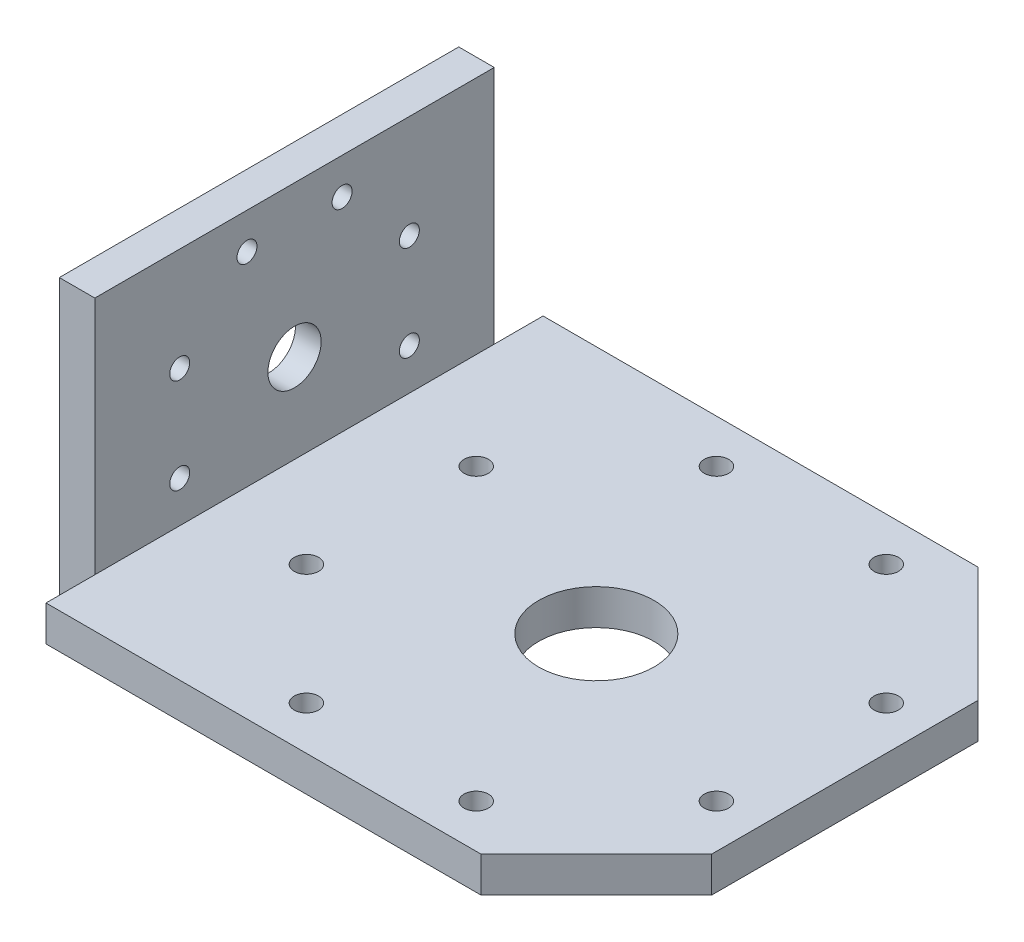
ISO-10303-21;
HEADER;
FILE_DESCRIPTION(('STEP AP214'),'2;1');
FILE_NAME('part.step','',(''),(''),'','','');
FILE_SCHEMA(('AUTOMOTIVE_DESIGN { 1 0 10303 214 1 1 1 1 }'));
ENDSEC;
DATA;
#1=APPLICATION_CONTEXT('core data for automotive mechanical design processes');
#2=APPLICATION_PROTOCOL_DEFINITION('international standard','automotive_design',2000,#1);
#3=PRODUCT_CONTEXT('',#1,'mechanical');
#4=PRODUCT('Part','Part','',(#3));
#5=PRODUCT_RELATED_PRODUCT_CATEGORY('part','',(#4));
#6=PRODUCT_DEFINITION_FORMATION('','',#4);
#7=PRODUCT_DEFINITION_CONTEXT('part definition',#1,'design');
#8=PRODUCT_DEFINITION('design','',#6,#7);
#9=PRODUCT_DEFINITION_SHAPE('','',#8);
#10=(LENGTH_UNIT() NAMED_UNIT(*) SI_UNIT(.MILLI.,.METRE.));
#11=(NAMED_UNIT(*) PLANE_ANGLE_UNIT() SI_UNIT($,.RADIAN.));
#12=(NAMED_UNIT(*) SI_UNIT($,.STERADIAN.) SOLID_ANGLE_UNIT());
#13=UNCERTAINTY_MEASURE_WITH_UNIT(LENGTH_MEASURE(1.E-05),#10,'distance_accuracy_value','');
#14=(GEOMETRIC_REPRESENTATION_CONTEXT(3) GLOBAL_UNCERTAINTY_ASSIGNED_CONTEXT((#13)) GLOBAL_UNIT_ASSIGNED_CONTEXT((#10,
#11,#12)) REPRESENTATION_CONTEXT('',''));
#15=CARTESIAN_POINT('',(0.,0.,0.));
#16=DIRECTION('',(0.,0.,1.));
#17=DIRECTION('',(1.,0.,0.));
#18=AXIS2_PLACEMENT_3D('',#15,#16,#17);
#19=CARTESIAN_POINT('',(-68.,0.,0.));
#20=DIRECTION('',(1.,0.,0.));
#21=DIRECTION('',(0.,0.,-1.));
#22=AXIS2_PLACEMENT_3D('',#19,#20,#21);
#23=PLANE('',#22);
#24=DIRECTION('',(0.,1.,0.));
#25=VECTOR('',#24,1.);
#26=CARTESIAN_POINT('',(-68.,-36.,-45.));
#27=LINE('',#26,#25);
#28=CARTESIAN_POINT('',(-68.,-36.,-45.));
#29=VERTEX_POINT('',#28);
#30=CARTESIAN_POINT('',(-68.,-28.,-45.));
#31=VERTEX_POINT('',#30);
#32=EDGE_CURVE('E240',#29,#31,#27,.T.);
#33=ORIENTED_EDGE('',*,*,#32,.T.);
#34=DIRECTION('',(0.,0.,1.));
#35=VECTOR('',#34,1.);
#36=CARTESIAN_POINT('',(-68.,-28.,56.));
#37=LINE('',#36,#35);
#38=CARTESIAN_POINT('',(-68.,-28.,-11.4360721315195));
#39=VERTEX_POINT('',#38);
#40=EDGE_CURVE('E11',#31,#39,#37,.T.);
#41=ORIENTED_EDGE('',*,*,#40,.T.);
#42=CARTESIAN_POINT('',(-68.,-25.868626910316,-10.7151361062225));
#43=DIRECTION('',(1.,0.,0.));
#44=DIRECTION('',(0.,0.,-1.));
#45=AXIS2_PLACEMENT_3D('',#42,#43,#44);
#46=CIRCLE('',#45,2.25);
#47=CARTESIAN_POINT('',(-68.,-28.,-9.99420008092556));
#48=VERTEX_POINT('',#47);
#49=EDGE_CURVE('E187',#48,#39,#46,.T.);
#50=ORIENTED_EDGE('',*,*,#49,.F.);
#51=CARTESIAN_POINT('',(-68.,-28.,9.99420008092553));
#52=VERTEX_POINT('',#51);
#53=EDGE_CURVE('E48',#48,#52,#37,.T.);
#54=ORIENTED_EDGE('',*,*,#53,.T.);
#55=CARTESIAN_POINT('',(-68.,-25.868626910316,10.7151361062225));
#56=DIRECTION('',(1.,0.,0.));
#57=DIRECTION('',(0.,0.,-1.));
#58=AXIS2_PLACEMENT_3D('',#55,#56,#57);
#59=CIRCLE('',#58,2.25);
#60=CARTESIAN_POINT('',(-68.,-28.,11.4360721315195));
#61=VERTEX_POINT('',#60);
#62=EDGE_CURVE('E193',#61,#52,#59,.T.);
#63=ORIENTED_EDGE('',*,*,#62,.F.);
#64=CARTESIAN_POINT('',(-68.,-28.,45.));
#65=VERTEX_POINT('',#64);
#66=EDGE_CURVE('E264',#61,#65,#37,.T.);
#67=ORIENTED_EDGE('',*,*,#66,.T.);
#68=DIRECTION('',(0.,-1.,0.));
#69=VECTOR('',#68,1.);
#70=CARTESIAN_POINT('',(-68.,34.,45.));
#71=LINE('',#70,#69);
#72=CARTESIAN_POINT('',(-68.,-36.,45.));
#73=VERTEX_POINT('',#72);
#74=EDGE_CURVE('E241',#65,#73,#71,.T.);
#75=ORIENTED_EDGE('',*,*,#74,.T.);
#76=DIRECTION('',(0.,0.,-1.));
#77=VECTOR('',#76,1.);
#78=CARTESIAN_POINT('',(-68.,-36.,45.));
#79=LINE('',#78,#77);
#80=EDGE_CURVE('E235',#73,#29,#79,.T.);
#81=ORIENTED_EDGE('',*,*,#80,.T.);
#82=EDGE_LOOP('',(#33,#41,#50,#54,#63,#67,#75,#81));
#83=FACE_BOUND('',#82,.T.);
#84=ADVANCED_FACE('F39',(#83),#23,.T.);
#85=DIRECTION('',(0.,0.,1.));
#86=VECTOR('',#85,1.);
#87=CARTESIAN_POINT('',(-68.,-20.,56.));
#88=LINE('',#87,#86);
#89=CARTESIAN_POINT('',(-68.,-20.,-45.));
#90=VERTEX_POINT('',#89);
#91=CARTESIAN_POINT('',(-68.,-20.,45.));
#92=VERTEX_POINT('',#91);
#93=EDGE_CURVE('E149',#90,#92,#88,.T.);
#94=ORIENTED_EDGE('',*,*,#93,.F.);
#95=CARTESIAN_POINT('',(-68.,34.,-45.));
#96=VERTEX_POINT('',#95);
#97=EDGE_CURVE('E233',#90,#96,#27,.T.);
#98=ORIENTED_EDGE('',*,*,#97,.T.);
#99=DIRECTION('',(0.,0.,1.));
#100=VECTOR('',#99,1.);
#101=CARTESIAN_POINT('',(-68.,34.,-45.));
#102=LINE('',#101,#100);
#103=CARTESIAN_POINT('',(-68.,34.,45.));
#104=VERTEX_POINT('',#103);
#105=EDGE_CURVE('E239',#96,#104,#102,.T.);
#106=ORIENTED_EDGE('',*,*,#105,.T.);
#107=EDGE_CURVE('E245',#104,#92,#71,.T.);
#108=ORIENTED_EDGE('',*,*,#107,.T.);
#109=EDGE_LOOP('',(#94,#98,#106,#108));
#110=FACE_BOUND('',#109,.T.);
#111=CARTESIAN_POINT('',(-68.,-10.7151361062225,-25.868626910316));
#112=DIRECTION('',(1.,0.,0.));
#113=DIRECTION('',(0.,0.,-1.));
#114=AXIS2_PLACEMENT_3D('',#111,#112,#113);
#115=CIRCLE('',#114,2.25);
#116=CARTESIAN_POINT('',(-68.,-10.7151361062225,-28.118626910316));
#117=VERTEX_POINT('',#116);
#118=EDGE_CURVE('E184',#117,#117,#115,.T.);
#119=ORIENTED_EDGE('',*,*,#118,.F.);
#120=EDGE_LOOP('',(#119));
#121=FACE_BOUND('',#120,.T.);
#122=CARTESIAN_POINT('',(-68.,10.7151361062225,25.868626910316));
#123=DIRECTION('',(1.,0.,0.));
#124=DIRECTION('',(0.,0.,-1.));
#125=AXIS2_PLACEMENT_3D('',#122,#123,#124);
#126=CIRCLE('',#125,2.25);
#127=CARTESIAN_POINT('',(-68.,10.7151361062225,23.618626910316));
#128=VERTEX_POINT('',#127);
#129=EDGE_CURVE('E208',#128,#128,#126,.T.);
#130=ORIENTED_EDGE('',*,*,#129,.F.);
#131=EDGE_LOOP('',(#130));
#132=FACE_BOUND('',#131,.T.);
#133=CARTESIAN_POINT('',(-68.,25.868626910316,-10.7151361062225));
#134=DIRECTION('',(1.,0.,0.));
#135=DIRECTION('',(0.,0.,-1.));
#136=AXIS2_PLACEMENT_3D('',#133,#134,#135);
#137=CIRCLE('',#136,2.25);
#138=CARTESIAN_POINT('',(-68.,25.868626910316,-12.9651361062225));
#139=VERTEX_POINT('',#138);
#140=EDGE_CURVE('E219',#139,#139,#137,.T.);
#141=ORIENTED_EDGE('',*,*,#140,.F.);
#142=EDGE_LOOP('',(#141));
#143=FACE_BOUND('',#142,.T.);
#144=CARTESIAN_POINT('',(-68.,10.7151361062225,-25.868626910316));
#145=DIRECTION('',(1.,0.,0.));
#146=DIRECTION('',(0.,0.,-1.));
#147=AXIS2_PLACEMENT_3D('',#144,#145,#146);
#148=CIRCLE('',#147,2.25);
#149=CARTESIAN_POINT('',(-68.,10.7151361062225,-28.118626910316));
#150=VERTEX_POINT('',#149);
#151=EDGE_CURVE('E229',#150,#150,#148,.T.);
#152=ORIENTED_EDGE('',*,*,#151,.F.);
#153=EDGE_LOOP('',(#152));
#154=FACE_BOUND('',#153,.T.);
#155=CARTESIAN_POINT('',(-68.,25.868626910316,10.7151361062225));
#156=DIRECTION('',(1.,0.,0.));
#157=DIRECTION('',(0.,0.,-1.));
#158=AXIS2_PLACEMENT_3D('',#155,#156,#157);
#159=CIRCLE('',#158,2.25);
#160=CARTESIAN_POINT('',(-68.,25.868626910316,8.46513610622251));
#161=VERTEX_POINT('',#160);
#162=EDGE_CURVE('E212',#161,#161,#159,.T.);
#163=ORIENTED_EDGE('',*,*,#162,.F.);
#164=EDGE_LOOP('',(#163));
#165=FACE_BOUND('',#164,.T.);
#166=CARTESIAN_POINT('',(-68.,-10.7151361062225,25.868626910316));
#167=DIRECTION('',(1.,0.,0.));
#168=DIRECTION('',(0.,0.,-1.));
#169=AXIS2_PLACEMENT_3D('',#166,#167,#168);
#170=CIRCLE('',#169,2.25);
#171=CARTESIAN_POINT('',(-68.,-10.7151361062225,23.618626910316));
#172=VERTEX_POINT('',#171);
#173=EDGE_CURVE('E205',#172,#172,#170,.T.);
#174=ORIENTED_EDGE('',*,*,#173,.F.);
#175=EDGE_LOOP('',(#174));
#176=FACE_BOUND('',#175,.T.);
#177=CARTESIAN_POINT('',(-68.,0.,0.));
#178=DIRECTION('',(1.,0.,0.));
#179=DIRECTION('',(0.,0.,-1.));
#180=AXIS2_PLACEMENT_3D('',#177,#178,#179);
#181=CIRCLE('',#180,6.);
#182=CARTESIAN_POINT('',(-68.,0.,-6.));
#183=VERTEX_POINT('',#182);
#184=EDGE_CURVE('E178',#183,#183,#181,.T.);
#185=ORIENTED_EDGE('',*,*,#184,.F.);
#186=EDGE_LOOP('',(#185));
#187=FACE_BOUND('',#186,.T.);
#188=ADVANCED_FACE('F281',(#110,#121,#132,#143,#154,#165,#176,#187),#23,.T.);
#189=CARTESIAN_POINT('',(-76.,0.,0.));
#190=DIRECTION('',(1.,0.,0.));
#191=DIRECTION('',(0.,0.,-1.));
#192=AXIS2_PLACEMENT_3D('',#189,#190,#191);
#193=PLANE('',#192);
#194=CARTESIAN_POINT('',(-76.,0.,0.));
#195=DIRECTION('',(1.,0.,0.));
#196=DIRECTION('',(0.,0.,-1.));
#197=AXIS2_PLACEMENT_3D('',#194,#195,#196);
#198=CIRCLE('',#197,22.15);
#199=CARTESIAN_POINT('',(-76.,0.,-22.15));
#200=VERTEX_POINT('',#199);
#201=EDGE_CURVE('E166',#200,#200,#198,.T.);
#202=ORIENTED_EDGE('',*,*,#201,.T.);
#203=EDGE_LOOP('',(#202));
#204=FACE_BOUND('',#203,.T.);
#205=DIRECTION('',(0.,0.,-1.));
#206=VECTOR('',#205,1.);
#207=CARTESIAN_POINT('',(-76.,-36.,45.));
#208=LINE('',#207,#206);
#209=CARTESIAN_POINT('',(-76.,-36.,45.));
#210=VERTEX_POINT('',#209);
#211=CARTESIAN_POINT('',(-76.,-36.,-45.));
#212=VERTEX_POINT('',#211);
#213=EDGE_CURVE('E228',#210,#212,#208,.T.);
#214=ORIENTED_EDGE('',*,*,#213,.F.);
#215=DIRECTION('',(0.,-1.,0.));
#216=VECTOR('',#215,1.);
#217=CARTESIAN_POINT('',(-76.,34.,45.));
#218=LINE('',#217,#216);
#219=CARTESIAN_POINT('',(-76.,34.,45.));
#220=VERTEX_POINT('',#219);
#221=EDGE_CURVE('E237',#220,#210,#218,.T.);
#222=ORIENTED_EDGE('',*,*,#221,.F.);
#223=DIRECTION('',(0.,0.,1.));
#224=VECTOR('',#223,1.);
#225=CARTESIAN_POINT('',(-76.,34.,-45.));
#226=LINE('',#225,#224);
#227=CARTESIAN_POINT('',(-76.,34.,-45.));
#228=VERTEX_POINT('',#227);
#229=EDGE_CURVE('E253',#228,#220,#226,.T.);
#230=ORIENTED_EDGE('',*,*,#229,.F.);
#231=DIRECTION('',(0.,1.,0.));
#232=VECTOR('',#231,1.);
#233=CARTESIAN_POINT('',(-76.,-36.,-45.));
#234=LINE('',#233,#232);
#235=EDGE_CURVE('E246',#212,#228,#234,.T.);
#236=ORIENTED_EDGE('',*,*,#235,.F.);
#237=EDGE_LOOP('',(#214,#222,#230,#236));
#238=FACE_BOUND('',#237,.T.);
#239=CARTESIAN_POINT('',(-76.,10.7151361062225,-25.868626910316));
#240=DIRECTION('',(1.,0.,0.));
#241=DIRECTION('',(0.,0.,-1.));
#242=AXIS2_PLACEMENT_3D('',#239,#240,#241);
#243=CIRCLE('',#242,2.25);
#244=CARTESIAN_POINT('',(-76.,10.7151361062225,-28.118626910316));
#245=VERTEX_POINT('',#244);
#246=EDGE_CURVE('E224',#245,#245,#243,.T.);
#247=ORIENTED_EDGE('',*,*,#246,.T.);
#248=EDGE_LOOP('',(#247));
#249=FACE_BOUND('',#248,.T.);
#250=CARTESIAN_POINT('',(-76.,25.868626910316,-10.7151361062225));
#251=DIRECTION('',(1.,0.,0.));
#252=DIRECTION('',(0.,0.,-1.));
#253=AXIS2_PLACEMENT_3D('',#250,#251,#252);
#254=CIRCLE('',#253,2.25);
#255=CARTESIAN_POINT('',(-76.,25.868626910316,-12.9651361062225));
#256=VERTEX_POINT('',#255);
#257=EDGE_CURVE('E220',#256,#256,#254,.T.);
#258=ORIENTED_EDGE('',*,*,#257,.T.);
#259=EDGE_LOOP('',(#258));
#260=FACE_BOUND('',#259,.T.);
#261=CARTESIAN_POINT('',(-76.,25.868626910316,10.7151361062225));
#262=DIRECTION('',(1.,0.,0.));
#263=DIRECTION('',(0.,0.,-1.));
#264=AXIS2_PLACEMENT_3D('',#261,#262,#263);
#265=CIRCLE('',#264,2.25);
#266=CARTESIAN_POINT('',(-76.,25.868626910316,8.46513610622251));
#267=VERTEX_POINT('',#266);
#268=EDGE_CURVE('E211',#267,#267,#265,.T.);
#269=ORIENTED_EDGE('',*,*,#268,.T.);
#270=EDGE_LOOP('',(#269));
#271=FACE_BOUND('',#270,.T.);
#272=CARTESIAN_POINT('',(-76.,10.7151361062225,25.868626910316));
#273=DIRECTION('',(1.,0.,0.));
#274=DIRECTION('',(0.,0.,-1.));
#275=AXIS2_PLACEMENT_3D('',#272,#273,#274);
#276=CIRCLE('',#275,2.25);
#277=CARTESIAN_POINT('',(-76.,10.7151361062225,23.618626910316));
#278=VERTEX_POINT('',#277);
#279=EDGE_CURVE('E202',#278,#278,#276,.T.);
#280=ORIENTED_EDGE('',*,*,#279,.T.);
#281=EDGE_LOOP('',(#280));
#282=FACE_BOUND('',#281,.T.);
#283=CARTESIAN_POINT('',(-76.,-10.7151361062225,25.868626910316));
#284=DIRECTION('',(1.,0.,0.));
#285=DIRECTION('',(0.,0.,-1.));
#286=AXIS2_PLACEMENT_3D('',#283,#284,#285);
#287=CIRCLE('',#286,2.25);
#288=CARTESIAN_POINT('',(-76.,-10.7151361062225,23.618626910316));
#289=VERTEX_POINT('',#288);
#290=EDGE_CURVE('E196',#289,#289,#287,.T.);
#291=ORIENTED_EDGE('',*,*,#290,.T.);
#292=EDGE_LOOP('',(#291));
#293=FACE_BOUND('',#292,.T.);
#294=CARTESIAN_POINT('',(-76.,-25.868626910316,10.7151361062225));
#295=DIRECTION('',(1.,0.,0.));
#296=DIRECTION('',(0.,0.,-1.));
#297=AXIS2_PLACEMENT_3D('',#294,#295,#296);
#298=CIRCLE('',#297,2.25);
#299=CARTESIAN_POINT('',(-76.,-25.868626910316,8.46513610622251));
#300=VERTEX_POINT('',#299);
#301=EDGE_CURVE('E195',#300,#300,#298,.T.);
#302=ORIENTED_EDGE('',*,*,#301,.T.);
#303=EDGE_LOOP('',(#302));
#304=FACE_BOUND('',#303,.T.);
#305=CARTESIAN_POINT('',(-76.,-25.868626910316,-10.7151361062225));
#306=DIRECTION('',(1.,0.,0.));
#307=DIRECTION('',(0.,0.,-1.));
#308=AXIS2_PLACEMENT_3D('',#305,#306,#307);
#309=CIRCLE('',#308,2.25);
#310=CARTESIAN_POINT('',(-76.,-25.868626910316,-12.9651361062225));
#311=VERTEX_POINT('',#310);
#312=EDGE_CURVE('E186',#311,#311,#309,.T.);
#313=ORIENTED_EDGE('',*,*,#312,.T.);
#314=EDGE_LOOP('',(#313));
#315=FACE_BOUND('',#314,.T.);
#316=CARTESIAN_POINT('',(-76.,-10.7151361062225,-25.868626910316));
#317=DIRECTION('',(1.,0.,0.));
#318=DIRECTION('',(0.,0.,-1.));
#319=AXIS2_PLACEMENT_3D('',#316,#317,#318);
#320=CIRCLE('',#319,2.25);
#321=CARTESIAN_POINT('',(-76.,-10.7151361062225,-28.118626910316));
#322=VERTEX_POINT('',#321);
#323=EDGE_CURVE('E181',#322,#322,#320,.T.);
#324=ORIENTED_EDGE('',*,*,#323,.T.);
#325=EDGE_LOOP('',(#324));
#326=FACE_BOUND('',#325,.T.);
#327=ADVANCED_FACE('F304',(#204,#238,#249,#260,#271,#282,#293,#304,#315,#326),#193,.F.);
#328=CARTESIAN_POINT('',(-68.,-36.,45.));
#329=DIRECTION('',(0.,1.,0.));
#330=DIRECTION('',(0.,0.,1.));
#331=AXIS2_PLACEMENT_3D('',#328,#329,#330);
#332=PLANE('',#331);
#333=ORIENTED_EDGE('',*,*,#213,.T.);
#334=DIRECTION('',(-1.,0.,0.));
#335=VECTOR('',#334,1.);
#336=CARTESIAN_POINT('',(-68.,-36.,-45.));
#337=LINE('',#336,#335);
#338=EDGE_CURVE('E261',#29,#212,#337,.T.);
#339=ORIENTED_EDGE('',*,*,#338,.F.);
#340=ORIENTED_EDGE('',*,*,#80,.F.);
#341=DIRECTION('',(-1.,0.,0.));
#342=VECTOR('',#341,1.);
#343=CARTESIAN_POINT('',(-68.,-36.,45.));
#344=LINE('',#343,#342);
#345=EDGE_CURVE('E242',#73,#210,#344,.T.);
#346=ORIENTED_EDGE('',*,*,#345,.T.);
#347=EDGE_LOOP('',(#333,#339,#340,#346));
#348=FACE_BOUND('',#347,.T.);
#349=ADVANCED_FACE('F41',(#348),#332,.F.);
#350=CARTESIAN_POINT('',(-68.,-36.,-45.));
#351=DIRECTION('',(0.,0.,1.));
#352=DIRECTION('',(1.,0.,0.));
#353=AXIS2_PLACEMENT_3D('',#350,#351,#352);
#354=PLANE('',#353);
#355=ORIENTED_EDGE('',*,*,#235,.T.);
#356=DIRECTION('',(-1.,0.,0.));
#357=VECTOR('',#356,1.);
#358=CARTESIAN_POINT('',(-68.,34.,-45.));
#359=LINE('',#358,#357);
#360=EDGE_CURVE('E259',#96,#228,#359,.T.);
#361=ORIENTED_EDGE('',*,*,#360,.F.);
#362=ORIENTED_EDGE('',*,*,#97,.F.);
#363=EDGE_CURVE('E238',#31,#90,#27,.T.);
#364=ORIENTED_EDGE('',*,*,#363,.F.);
#365=ORIENTED_EDGE('',*,*,#32,.F.);
#366=ORIENTED_EDGE('',*,*,#338,.T.);
#367=EDGE_LOOP('',(#355,#361,#362,#364,#365,#366));
#368=FACE_BOUND('',#367,.T.);
#369=ADVANCED_FACE('F287',(#368),#354,.F.);
#370=CARTESIAN_POINT('',(-68.,34.,-45.));
#371=DIRECTION('',(0.,-1.,0.));
#372=DIRECTION('',(0.,0.,-1.));
#373=AXIS2_PLACEMENT_3D('',#370,#371,#372);
#374=PLANE('',#373);
#375=ORIENTED_EDGE('',*,*,#229,.T.);
#376=DIRECTION('',(-1.,0.,0.));
#377=VECTOR('',#376,1.);
#378=CARTESIAN_POINT('',(-68.,34.,45.));
#379=LINE('',#378,#377);
#380=EDGE_CURVE('E258',#104,#220,#379,.T.);
#381=ORIENTED_EDGE('',*,*,#380,.F.);
#382=ORIENTED_EDGE('',*,*,#105,.F.);
#383=ORIENTED_EDGE('',*,*,#360,.T.);
#384=EDGE_LOOP('',(#375,#381,#382,#383));
#385=FACE_BOUND('',#384,.T.);
#386=ADVANCED_FACE('F286',(#385),#374,.F.);
#387=CARTESIAN_POINT('',(-68.,34.,45.));
#388=DIRECTION('',(0.,0.,-1.));
#389=DIRECTION('',(-1.,0.,0.));
#390=AXIS2_PLACEMENT_3D('',#387,#388,#389);
#391=PLANE('',#390);
#392=ORIENTED_EDGE('',*,*,#221,.T.);
#393=ORIENTED_EDGE('',*,*,#345,.F.);
#394=ORIENTED_EDGE('',*,*,#74,.F.);
#395=EDGE_CURVE('E247',#92,#65,#71,.T.);
#396=ORIENTED_EDGE('',*,*,#395,.F.);
#397=ORIENTED_EDGE('',*,*,#107,.F.);
#398=ORIENTED_EDGE('',*,*,#380,.T.);
#399=EDGE_LOOP('',(#392,#393,#394,#396,#397,#398));
#400=FACE_BOUND('',#399,.T.);
#401=ADVANCED_FACE('F294',(#400),#391,.F.);
#402=CARTESIAN_POINT('',(-68.,10.7151361062225,-25.868626910316));
#403=DIRECTION('',(-1.,0.,0.));
#404=DIRECTION('',(0.,0.,1.));
#405=AXIS2_PLACEMENT_3D('',#402,#403,#404);
#406=CYLINDRICAL_SURFACE('',#405,2.25);
#407=ORIENTED_EDGE('',*,*,#151,.T.);
#408=EDGE_LOOP('',(#407));
#409=FACE_BOUND('',#408,.T.);
#410=ORIENTED_EDGE('',*,*,#246,.F.);
#411=EDGE_LOOP('',(#410));
#412=FACE_BOUND('',#411,.T.);
#413=ADVANCED_FACE('F350',(#409,#412),#406,.F.);
#414=CARTESIAN_POINT('',(-68.,25.868626910316,-10.7151361062225));
#415=DIRECTION('',(-1.,0.,0.));
#416=DIRECTION('',(0.,0.,1.));
#417=AXIS2_PLACEMENT_3D('',#414,#415,#416);
#418=CYLINDRICAL_SURFACE('',#417,2.25);
#419=ORIENTED_EDGE('',*,*,#140,.T.);
#420=EDGE_LOOP('',(#419));
#421=FACE_BOUND('',#420,.T.);
#422=ORIENTED_EDGE('',*,*,#257,.F.);
#423=EDGE_LOOP('',(#422));
#424=FACE_BOUND('',#423,.T.);
#425=ADVANCED_FACE('F373',(#421,#424),#418,.F.);
#426=CARTESIAN_POINT('',(-68.,25.868626910316,10.7151361062225));
#427=DIRECTION('',(-1.,0.,0.));
#428=DIRECTION('',(0.,0.,1.));
#429=AXIS2_PLACEMENT_3D('',#426,#427,#428);
#430=CYLINDRICAL_SURFACE('',#429,2.25);
#431=ORIENTED_EDGE('',*,*,#162,.T.);
#432=EDGE_LOOP('',(#431));
#433=FACE_BOUND('',#432,.T.);
#434=ORIENTED_EDGE('',*,*,#268,.F.);
#435=EDGE_LOOP('',(#434));
#436=FACE_BOUND('',#435,.T.);
#437=ADVANCED_FACE('F381',(#433,#436),#430,.F.);
#438=CARTESIAN_POINT('',(-68.,10.7151361062225,25.868626910316));
#439=DIRECTION('',(-1.,0.,0.));
#440=DIRECTION('',(0.,0.,1.));
#441=AXIS2_PLACEMENT_3D('',#438,#439,#440);
#442=CYLINDRICAL_SURFACE('',#441,2.25);
#443=ORIENTED_EDGE('',*,*,#129,.T.);
#444=EDGE_LOOP('',(#443));
#445=FACE_BOUND('',#444,.T.);
#446=ORIENTED_EDGE('',*,*,#279,.F.);
#447=EDGE_LOOP('',(#446));
#448=FACE_BOUND('',#447,.T.);
#449=ADVANCED_FACE('F386',(#445,#448),#442,.F.);
#450=CARTESIAN_POINT('',(-68.,-10.7151361062225,25.868626910316));
#451=DIRECTION('',(-1.,0.,0.));
#452=DIRECTION('',(0.,0.,1.));
#453=AXIS2_PLACEMENT_3D('',#450,#451,#452);
#454=CYLINDRICAL_SURFACE('',#453,2.25);
#455=ORIENTED_EDGE('',*,*,#173,.T.);
#456=EDGE_LOOP('',(#455));
#457=FACE_BOUND('',#456,.T.);
#458=ORIENTED_EDGE('',*,*,#290,.F.);
#459=EDGE_LOOP('',(#458));
#460=FACE_BOUND('',#459,.T.);
#461=ADVANCED_FACE('F400',(#457,#460),#454,.F.);
#462=CARTESIAN_POINT('',(-68.,-25.868626910316,10.7151361062225));
#463=DIRECTION('',(-1.,0.,0.));
#464=DIRECTION('',(0.,0.,1.));
#465=AXIS2_PLACEMENT_3D('',#462,#463,#464);
#466=CYLINDRICAL_SURFACE('',#465,2.25);
#467=ORIENTED_EDGE('',*,*,#62,.T.);
#468=EDGE_CURVE('E200',#52,#61,#59,.T.);
#469=ORIENTED_EDGE('',*,*,#468,.T.);
#470=EDGE_LOOP('',(#467,#469));
#471=FACE_BOUND('',#470,.T.);
#472=ORIENTED_EDGE('',*,*,#301,.F.);
#473=EDGE_LOOP('',(#472));
#474=FACE_BOUND('',#473,.T.);
#475=ADVANCED_FACE('F340',(#471,#474),#466,.F.);
#476=CARTESIAN_POINT('',(-68.,-25.868626910316,-10.7151361062225));
#477=DIRECTION('',(-1.,0.,0.));
#478=DIRECTION('',(0.,0.,1.));
#479=AXIS2_PLACEMENT_3D('',#476,#477,#478);
#480=CYLINDRICAL_SURFACE('',#479,2.25);
#481=ORIENTED_EDGE('',*,*,#49,.T.);
#482=EDGE_CURVE('E64',#39,#48,#46,.T.);
#483=ORIENTED_EDGE('',*,*,#482,.T.);
#484=EDGE_LOOP('',(#481,#483));
#485=FACE_BOUND('',#484,.T.);
#486=ORIENTED_EDGE('',*,*,#312,.F.);
#487=EDGE_LOOP('',(#486));
#488=FACE_BOUND('',#487,.T.);
#489=ADVANCED_FACE('F330',(#485,#488),#480,.F.);
#490=CARTESIAN_POINT('',(-68.,-10.7151361062225,-25.868626910316));
#491=DIRECTION('',(-1.,0.,0.));
#492=DIRECTION('',(0.,0.,1.));
#493=AXIS2_PLACEMENT_3D('',#490,#491,#492);
#494=CYLINDRICAL_SURFACE('',#493,2.25);
#495=ORIENTED_EDGE('',*,*,#118,.T.);
#496=EDGE_LOOP('',(#495));
#497=FACE_BOUND('',#496,.T.);
#498=ORIENTED_EDGE('',*,*,#323,.F.);
#499=EDGE_LOOP('',(#498));
#500=FACE_BOUND('',#499,.T.);
#501=ADVANCED_FACE('F322',(#497,#500),#494,.F.);
#502=CARTESIAN_POINT('',(-68.,0.,0.));
#503=DIRECTION('',(-1.,0.,0.));
#504=DIRECTION('',(0.,0.,1.));
#505=AXIS2_PLACEMENT_3D('',#502,#503,#504);
#506=CYLINDRICAL_SURFACE('',#505,6.);
#507=CARTESIAN_POINT('',(-73.8,0.,0.));
#508=DIRECTION('',(1.,0.,0.));
#509=DIRECTION('',(0.,0.,-1.));
#510=AXIS2_PLACEMENT_3D('',#507,#508,#509);
#511=CIRCLE('',#510,6.);
#512=CARTESIAN_POINT('',(-73.8,0.,-6.));
#513=VERTEX_POINT('',#512);
#514=EDGE_CURVE('E43',#513,#513,#511,.T.);
#515=ORIENTED_EDGE('',*,*,#514,.F.);
#516=EDGE_LOOP('',(#515));
#517=FACE_BOUND('',#516,.T.);
#518=ORIENTED_EDGE('',*,*,#184,.T.);
#519=EDGE_LOOP('',(#518));
#520=FACE_BOUND('',#519,.T.);
#521=ADVANCED_FACE('F326',(#517,#520),#506,.F.);
#522=CARTESIAN_POINT('',(-73.8,0.,0.));
#523=DIRECTION('',(-1.,0.,0.));
#524=DIRECTION('',(0.,0.,1.));
#525=AXIS2_PLACEMENT_3D('',#522,#523,#524);
#526=CYLINDRICAL_SURFACE('',#525,22.15);
#527=CARTESIAN_POINT('',(-73.8,0.,0.));
#528=DIRECTION('',(1.,0.,0.));
#529=DIRECTION('',(0.,0.,-1.));
#530=AXIS2_PLACEMENT_3D('',#527,#528,#529);
#531=CIRCLE('',#530,22.15);
#532=CARTESIAN_POINT('',(-73.8,0.,-22.15));
#533=VERTEX_POINT('',#532);
#534=EDGE_CURVE('E171',#533,#533,#531,.T.);
#535=ORIENTED_EDGE('',*,*,#534,.T.);
#536=EDGE_LOOP('',(#535));
#537=FACE_BOUND('',#536,.T.);
#538=ORIENTED_EDGE('',*,*,#201,.F.);
#539=EDGE_LOOP('',(#538));
#540=FACE_BOUND('',#539,.T.);
#541=ADVANCED_FACE('F331',(#537,#540),#526,.F.);
#542=CARTESIAN_POINT('',(-73.8,0.,0.));
#543=DIRECTION('',(1.,0.,0.));
#544=DIRECTION('',(0.,0.,-1.));
#545=AXIS2_PLACEMENT_3D('',#542,#543,#544);
#546=PLANE('',#545);
#547=ORIENTED_EDGE('',*,*,#514,.T.);
#548=EDGE_LOOP('',(#547));
#549=FACE_BOUND('',#548,.T.);
#550=ORIENTED_EDGE('',*,*,#534,.F.);
#551=EDGE_LOOP('',(#550));
#552=FACE_BOUND('',#551,.T.);
#553=ADVANCED_FACE('F444',(#549,#552),#546,.F.);
#554=CARTESIAN_POINT('',(-68.,-20.,56.));
#555=DIRECTION('',(1.,0.,0.));
#556=DIRECTION('',(0.,0.,-1.));
#557=AXIS2_PLACEMENT_3D('',#554,#555,#556);
#558=PLANE('',#557);
#559=CARTESIAN_POINT('',(-68.,-28.,-56.));
#560=VERTEX_POINT('',#559);
#561=EDGE_CURVE('E266',#560,#31,#37,.T.);
#562=ORIENTED_EDGE('',*,*,#561,.T.);
#563=ORIENTED_EDGE('',*,*,#363,.T.);
#564=CARTESIAN_POINT('',(-68.,-20.,-56.));
#565=VERTEX_POINT('',#564);
#566=EDGE_CURVE('E153',#565,#90,#88,.T.);
#567=ORIENTED_EDGE('',*,*,#566,.F.);
#568=DIRECTION('',(0.,-1.,0.));
#569=VECTOR('',#568,1.);
#570=CARTESIAN_POINT('',(-68.,-20.,-56.));
#571=LINE('',#570,#569);
#572=EDGE_CURVE('E280',#565,#560,#571,.T.);
#573=ORIENTED_EDGE('',*,*,#572,.T.);
#574=EDGE_LOOP('',(#562,#563,#567,#573));
#575=FACE_BOUND('',#574,.T.);
#576=ADVANCED_FACE('F277',(#575),#558,.F.);
#577=CARTESIAN_POINT('',(-68.,-20.,56.));
#578=VERTEX_POINT('',#577);
#579=EDGE_CURVE('E142',#92,#578,#88,.T.);
#580=ORIENTED_EDGE('',*,*,#579,.F.);
#581=ORIENTED_EDGE('',*,*,#395,.T.);
#582=CARTESIAN_POINT('',(-68.,-28.,56.));
#583=VERTEX_POINT('',#582);
#584=EDGE_CURVE('E170',#65,#583,#37,.T.);
#585=ORIENTED_EDGE('',*,*,#584,.T.);
#586=DIRECTION('',(0.,-1.,0.));
#587=VECTOR('',#586,1.);
#588=CARTESIAN_POINT('',(-68.,-20.,56.));
#589=LINE('',#588,#587);
#590=EDGE_CURVE('E157',#578,#583,#589,.T.);
#591=ORIENTED_EDGE('',*,*,#590,.F.);
#592=EDGE_LOOP('',(#580,#581,#585,#591));
#593=FACE_BOUND('',#592,.T.);
#594=ADVANCED_FACE('F164',(#593),#558,.F.);
#595=ORIENTED_EDGE('',*,*,#468,.F.);
#596=EDGE_CURVE('E720',#52,#61,#37,.T.);
#597=ORIENTED_EDGE('',*,*,#596,.T.);
#598=EDGE_LOOP('',(#595,#597));
#599=FACE_BOUND('',#598,.T.);
#600=ADVANCED_FACE('F471',(#599),#558,.F.);
#601=CARTESIAN_POINT('',(0.,-20.,0.));
#602=DIRECTION('',(0.,-1.,0.));
#603=DIRECTION('',(0.,0.,-1.));
#604=AXIS2_PLACEMENT_3D('',#601,#602,#603);
#605=PLANE('',#604);
#606=ORIENTED_EDGE('',*,*,#566,.T.);
#607=ORIENTED_EDGE('',*,*,#93,.T.);
#608=ORIENTED_EDGE('',*,*,#579,.T.);
#609=DIRECTION('',(1.,0.,0.));
#610=VECTOR('',#609,1.);
#611=CARTESIAN_POINT('',(30.,-20.,56.));
#612=LINE('',#611,#610);
#613=CARTESIAN_POINT('',(30.,-20.,56.));
#614=VERTEX_POINT('',#613);
#615=EDGE_CURVE('E150',#578,#614,#612,.T.);
#616=ORIENTED_EDGE('',*,*,#615,.T.);
#617=DIRECTION('',(0.707106781186548,0.,-0.707106781186548));
#618=VECTOR('',#617,1.);
#619=CARTESIAN_POINT('',(56.,-20.,30.));
#620=LINE('',#619,#618);
#621=CARTESIAN_POINT('',(56.,-20.,30.));
#622=VERTEX_POINT('',#621);
#623=EDGE_CURVE('E162',#614,#622,#620,.T.);
#624=ORIENTED_EDGE('',*,*,#623,.T.);
#625=DIRECTION('',(0.,0.,-1.));
#626=VECTOR('',#625,1.);
#627=CARTESIAN_POINT('',(56.,-20.,-30.));
#628=LINE('',#627,#626);
#629=CARTESIAN_POINT('',(56.,-20.,-30.));
#630=VERTEX_POINT('',#629);
#631=EDGE_CURVE('E739',#622,#630,#628,.T.);
#632=ORIENTED_EDGE('',*,*,#631,.T.);
#633=DIRECTION('',(-0.707106781186548,0.,-0.707106781186548));
#634=VECTOR('',#633,1.);
#635=CARTESIAN_POINT('',(30.,-20.,-56.));
#636=LINE('',#635,#634);
#637=CARTESIAN_POINT('',(30.,-20.,-56.));
#638=VERTEX_POINT('',#637);
#639=EDGE_CURVE('E740',#630,#638,#636,.T.);
#640=ORIENTED_EDGE('',*,*,#639,.T.);
#641=DIRECTION('',(-1.,0.,0.));
#642=VECTOR('',#641,1.);
#643=CARTESIAN_POINT('',(-68.,-20.,-56.));
#644=LINE('',#643,#642);
#645=EDGE_CURVE('E269',#638,#565,#644,.T.);
#646=ORIENTED_EDGE('',*,*,#645,.T.);
#647=EDGE_LOOP('',(#606,#607,#608,#616,#624,#632,#640,#646));
#648=FACE_BOUND('',#647,.T.);
#649=CARTESIAN_POINT('',(46.1939766255643,-20.,-19.1341716182545));
#650=DIRECTION('',(0.,1.,0.));
#651=DIRECTION('',(0.,0.,1.));
#652=AXIS2_PLACEMENT_3D('',#649,#650,#651);
#653=CIRCLE('',#652,2.75);
#654=CARTESIAN_POINT('',(46.1939766255643,-20.,-16.3841716182545));
#655=VERTEX_POINT('',#654);
#656=EDGE_CURVE('E701',#655,#655,#653,.T.);
#657=ORIENTED_EDGE('',*,*,#656,.F.);
#658=EDGE_LOOP('',(#657));
#659=FACE_BOUND('',#658,.T.);
#660=CARTESIAN_POINT('',(19.1341716182545,-20.,-46.1939766255643));
#661=DIRECTION('',(0.,1.,0.));
#662=DIRECTION('',(0.,0.,1.));
#663=AXIS2_PLACEMENT_3D('',#660,#661,#662);
#664=CIRCLE('',#663,2.75);
#665=CARTESIAN_POINT('',(19.1341716182545,-20.,-43.4439766255643));
#666=VERTEX_POINT('',#665);
#667=EDGE_CURVE('E694',#666,#666,#664,.T.);
#668=ORIENTED_EDGE('',*,*,#667,.F.);
#669=EDGE_LOOP('',(#668));
#670=FACE_BOUND('',#669,.T.);
#671=CARTESIAN_POINT('',(-19.1341716182545,-20.,-46.1939766255643));
#672=DIRECTION('',(0.,1.,0.));
#673=DIRECTION('',(0.,0.,1.));
#674=AXIS2_PLACEMENT_3D('',#671,#672,#673);
#675=CIRCLE('',#674,2.75);
#676=CARTESIAN_POINT('',(-19.1341716182545,-20.,-43.4439766255643));
#677=VERTEX_POINT('',#676);
#678=EDGE_CURVE('E686',#677,#677,#675,.T.);
#679=ORIENTED_EDGE('',*,*,#678,.F.);
#680=EDGE_LOOP('',(#679));
#681=FACE_BOUND('',#680,.T.);
#682=CARTESIAN_POINT('',(-46.1939766255643,-20.,-19.1341716182545));
#683=DIRECTION('',(0.,1.,0.));
#684=DIRECTION('',(0.,0.,1.));
#685=AXIS2_PLACEMENT_3D('',#682,#683,#684);
#686=CIRCLE('',#685,2.75);
#687=CARTESIAN_POINT('',(-46.1939766255643,-20.,-16.3841716182545));
#688=VERTEX_POINT('',#687);
#689=EDGE_CURVE('E685',#688,#688,#686,.T.);
#690=ORIENTED_EDGE('',*,*,#689,.F.);
#691=EDGE_LOOP('',(#690));
#692=FACE_BOUND('',#691,.T.);
#693=CARTESIAN_POINT('',(-46.1939766255643,-20.,19.1341716182545));
#694=DIRECTION('',(0.,1.,0.));
#695=DIRECTION('',(0.,0.,1.));
#696=AXIS2_PLACEMENT_3D('',#693,#694,#695);
#697=CIRCLE('',#696,2.75);
#698=CARTESIAN_POINT('',(-46.1939766255643,-20.,21.8841716182545));
#699=VERTEX_POINT('',#698);
#700=EDGE_CURVE('E680',#699,#699,#697,.T.);
#701=ORIENTED_EDGE('',*,*,#700,.F.);
#702=EDGE_LOOP('',(#701));
#703=FACE_BOUND('',#702,.T.);
#704=CARTESIAN_POINT('',(-19.1341716182545,-20.,46.1939766255643));
#705=DIRECTION('',(0.,1.,0.));
#706=DIRECTION('',(0.,0.,1.));
#707=AXIS2_PLACEMENT_3D('',#704,#705,#706);
#708=CIRCLE('',#707,2.75);
#709=CARTESIAN_POINT('',(-19.1341716182545,-20.,48.9439766255644));
#710=VERTEX_POINT('',#709);
#711=EDGE_CURVE('E672',#710,#710,#708,.T.);
#712=ORIENTED_EDGE('',*,*,#711,.F.);
#713=EDGE_LOOP('',(#712));
#714=FACE_BOUND('',#713,.T.);
#715=CARTESIAN_POINT('',(19.1341716182545,-20.,46.1939766255643));
#716=DIRECTION('',(0.,1.,0.));
#717=DIRECTION('',(0.,0.,1.));
#718=AXIS2_PLACEMENT_3D('',#715,#716,#717);
#719=CIRCLE('',#718,2.75);
#720=CARTESIAN_POINT('',(19.1341716182545,-20.,48.9439766255643));
#721=VERTEX_POINT('',#720);
#722=EDGE_CURVE('E663',#721,#721,#719,.T.);
#723=ORIENTED_EDGE('',*,*,#722,.F.);
#724=EDGE_LOOP('',(#723));
#725=FACE_BOUND('',#724,.T.);
#726=CARTESIAN_POINT('',(46.1939766255643,-20.,19.1341716182545));
#727=DIRECTION('',(0.,1.,0.));
#728=DIRECTION('',(0.,0.,1.));
#729=AXIS2_PLACEMENT_3D('',#726,#727,#728);
#730=CIRCLE('',#729,2.75);
#731=CARTESIAN_POINT('',(46.1939766255643,-20.,21.8841716182545));
#732=VERTEX_POINT('',#731);
#733=EDGE_CURVE('E658',#732,#732,#730,.T.);
#734=ORIENTED_EDGE('',*,*,#733,.F.);
#735=EDGE_LOOP('',(#734));
#736=FACE_BOUND('',#735,.T.);
#737=CARTESIAN_POINT('',(0.,-20.,0.));
#738=DIRECTION('',(0.,1.,0.));
#739=DIRECTION('',(0.,0.,1.));
#740=AXIS2_PLACEMENT_3D('',#737,#738,#739);
#741=CIRCLE('',#740,13.);
#742=CARTESIAN_POINT('',(0.,-20.,13.));
#743=VERTEX_POINT('',#742);
#744=EDGE_CURVE('E649',#743,#743,#741,.T.);
#745=ORIENTED_EDGE('',*,*,#744,.F.);
#746=EDGE_LOOP('',(#745));
#747=FACE_BOUND('',#746,.T.);
#748=ADVANCED_FACE('F144',(#648,#659,#670,#681,#692,#703,#714,#725,#736,#747),#605,.F.);
#749=CARTESIAN_POINT('',(0.,-28.,0.));
#750=DIRECTION('',(0.,-1.,0.));
#751=DIRECTION('',(0.,0.,-1.));
#752=AXIS2_PLACEMENT_3D('',#749,#750,#751);
#753=PLANE('',#752);
#754=CARTESIAN_POINT('',(46.1939766255643,-28.,19.1341716182545));
#755=DIRECTION('',(0.,1.,0.));
#756=DIRECTION('',(0.,0.,1.));
#757=AXIS2_PLACEMENT_3D('',#754,#755,#756);
#758=CIRCLE('',#757,2.75);
#759=CARTESIAN_POINT('',(46.1939766255643,-28.,21.8841716182545));
#760=VERTEX_POINT('',#759);
#761=EDGE_CURVE('E656',#760,#760,#758,.T.);
#762=ORIENTED_EDGE('',*,*,#761,.T.);
#763=EDGE_LOOP('',(#762));
#764=FACE_BOUND('',#763,.T.);
#765=CARTESIAN_POINT('',(-19.1341716182545,-28.,46.1939766255643));
#766=DIRECTION('',(0.,1.,0.));
#767=DIRECTION('',(0.,0.,1.));
#768=AXIS2_PLACEMENT_3D('',#765,#766,#767);
#769=CIRCLE('',#768,2.75);
#770=CARTESIAN_POINT('',(-19.1341716182545,-28.,48.9439766255644));
#771=VERTEX_POINT('',#770);
#772=EDGE_CURVE('E670',#771,#771,#769,.T.);
#773=ORIENTED_EDGE('',*,*,#772,.T.);
#774=EDGE_LOOP('',(#773));
#775=FACE_BOUND('',#774,.T.);
#776=CARTESIAN_POINT('',(-46.1939766255643,-28.,-19.1341716182545));
#777=DIRECTION('',(0.,1.,0.));
#778=DIRECTION('',(0.,0.,1.));
#779=AXIS2_PLACEMENT_3D('',#776,#777,#778);
#780=CIRCLE('',#779,2.75);
#781=CARTESIAN_POINT('',(-46.1939766255643,-28.,-16.3841716182545));
#782=VERTEX_POINT('',#781);
#783=EDGE_CURVE('E678',#782,#782,#780,.T.);
#784=ORIENTED_EDGE('',*,*,#783,.T.);
#785=EDGE_LOOP('',(#784));
#786=FACE_BOUND('',#785,.T.);
#787=CARTESIAN_POINT('',(19.1341716182545,-28.,-46.1939766255643));
#788=DIRECTION('',(0.,1.,0.));
#789=DIRECTION('',(0.,0.,1.));
#790=AXIS2_PLACEMENT_3D('',#787,#788,#789);
#791=CIRCLE('',#790,2.75);
#792=CARTESIAN_POINT('',(19.1341716182545,-28.,-43.4439766255643));
#793=VERTEX_POINT('',#792);
#794=EDGE_CURVE('E692',#793,#793,#791,.T.);
#795=ORIENTED_EDGE('',*,*,#794,.T.);
#796=EDGE_LOOP('',(#795));
#797=FACE_BOUND('',#796,.T.);
#798=ORIENTED_EDGE('',*,*,#561,.F.);
#799=DIRECTION('',(-1.,0.,0.));
#800=VECTOR('',#799,1.);
#801=CARTESIAN_POINT('',(-68.,-28.,-56.));
#802=LINE('',#801,#800);
#803=CARTESIAN_POINT('',(30.,-28.,-56.));
#804=VERTEX_POINT('',#803);
#805=EDGE_CURVE('E152',#804,#560,#802,.T.);
#806=ORIENTED_EDGE('',*,*,#805,.F.);
#807=DIRECTION('',(-0.707106781186548,0.,-0.707106781186548));
#808=VECTOR('',#807,1.);
#809=CARTESIAN_POINT('',(30.,-28.,-56.));
#810=LINE('',#809,#808);
#811=CARTESIAN_POINT('',(56.,-28.,-30.));
#812=VERTEX_POINT('',#811);
#813=EDGE_CURVE('E754',#812,#804,#810,.T.);
#814=ORIENTED_EDGE('',*,*,#813,.F.);
#815=DIRECTION('',(0.,0.,-1.));
#816=VECTOR('',#815,1.);
#817=CARTESIAN_POINT('',(56.,-28.,-30.));
#818=LINE('',#817,#816);
#819=CARTESIAN_POINT('',(56.,-28.,30.));
#820=VERTEX_POINT('',#819);
#821=EDGE_CURVE('E753',#820,#812,#818,.T.);
#822=ORIENTED_EDGE('',*,*,#821,.F.);
#823=DIRECTION('',(0.707106781186548,0.,-0.707106781186548));
#824=VECTOR('',#823,1.);
#825=CARTESIAN_POINT('',(56.,-28.,30.));
#826=LINE('',#825,#824);
#827=CARTESIAN_POINT('',(30.,-28.,56.));
#828=VERTEX_POINT('',#827);
#829=EDGE_CURVE('E721',#828,#820,#826,.T.);
#830=ORIENTED_EDGE('',*,*,#829,.F.);
#831=DIRECTION('',(1.,0.,0.));
#832=VECTOR('',#831,1.);
#833=CARTESIAN_POINT('',(30.,-28.,56.));
#834=LINE('',#833,#832);
#835=EDGE_CURVE('E724',#583,#828,#834,.T.);
#836=ORIENTED_EDGE('',*,*,#835,.F.);
#837=ORIENTED_EDGE('',*,*,#584,.F.);
#838=ORIENTED_EDGE('',*,*,#66,.F.);
#839=ORIENTED_EDGE('',*,*,#596,.F.);
#840=ORIENTED_EDGE('',*,*,#53,.F.);
#841=EDGE_CURVE('E49',#39,#48,#37,.T.);
#842=ORIENTED_EDGE('',*,*,#841,.F.);
#843=ORIENTED_EDGE('',*,*,#40,.F.);
#844=EDGE_LOOP('',(#798,#806,#814,#822,#830,#836,#837,#838,#839,#840,#842,#843));
#845=FACE_BOUND('',#844,.T.);
#846=CARTESIAN_POINT('',(46.1939766255643,-28.,-19.1341716182545));
#847=DIRECTION('',(0.,1.,0.));
#848=DIRECTION('',(0.,0.,1.));
#849=AXIS2_PLACEMENT_3D('',#846,#847,#848);
#850=CIRCLE('',#849,2.75);
#851=CARTESIAN_POINT('',(46.1939766255643,-28.,-16.3841716182545));
#852=VERTEX_POINT('',#851);
#853=EDGE_CURVE('E696',#852,#852,#850,.T.);
#854=ORIENTED_EDGE('',*,*,#853,.T.);
#855=EDGE_LOOP('',(#854));
#856=FACE_BOUND('',#855,.T.);
#857=CARTESIAN_POINT('',(-19.1341716182545,-28.,-46.1939766255643));
#858=DIRECTION('',(0.,1.,0.));
#859=DIRECTION('',(0.,0.,1.));
#860=AXIS2_PLACEMENT_3D('',#857,#858,#859);
#861=CIRCLE('',#860,2.75);
#862=CARTESIAN_POINT('',(-19.1341716182545,-28.,-43.4439766255643));
#863=VERTEX_POINT('',#862);
#864=EDGE_CURVE('E687',#863,#863,#861,.T.);
#865=ORIENTED_EDGE('',*,*,#864,.T.);
#866=EDGE_LOOP('',(#865));
#867=FACE_BOUND('',#866,.T.);
#868=CARTESIAN_POINT('',(-46.1939766255643,-28.,19.1341716182545));
#869=DIRECTION('',(0.,1.,0.));
#870=DIRECTION('',(0.,0.,1.));
#871=AXIS2_PLACEMENT_3D('',#868,#869,#870);
#872=CIRCLE('',#871,2.75);
#873=CARTESIAN_POINT('',(-46.1939766255643,-28.,21.8841716182545));
#874=VERTEX_POINT('',#873);
#875=EDGE_CURVE('E671',#874,#874,#872,.T.);
#876=ORIENTED_EDGE('',*,*,#875,.T.);
#877=EDGE_LOOP('',(#876));
#878=FACE_BOUND('',#877,.T.);
#879=CARTESIAN_POINT('',(19.1341716182545,-28.,46.1939766255643));
#880=DIRECTION('',(0.,1.,0.));
#881=DIRECTION('',(0.,0.,1.));
#882=AXIS2_PLACEMENT_3D('',#879,#880,#881);
#883=CIRCLE('',#882,2.75);
#884=CARTESIAN_POINT('',(19.1341716182545,-28.,48.9439766255643));
#885=VERTEX_POINT('',#884);
#886=EDGE_CURVE('E665',#885,#885,#883,.T.);
#887=ORIENTED_EDGE('',*,*,#886,.T.);
#888=EDGE_LOOP('',(#887));
#889=FACE_BOUND('',#888,.T.);
#890=CARTESIAN_POINT('',(0.,-28.,0.));
#891=DIRECTION('',(0.,1.,0.));
#892=DIRECTION('',(0.,0.,1.));
#893=AXIS2_PLACEMENT_3D('',#890,#891,#892);
#894=CIRCLE('',#893,13.);
#895=CARTESIAN_POINT('',(0.,-28.,13.));
#896=VERTEX_POINT('',#895);
#897=EDGE_CURVE('E653',#896,#896,#894,.T.);
#898=ORIENTED_EDGE('',*,*,#897,.T.);
#899=EDGE_LOOP('',(#898));
#900=FACE_BOUND('',#899,.T.);
#901=ADVANCED_FACE('F487',(#764,#775,#786,#797,#845,#856,#867,#878,#889,#900),#753,.T.);
#902=ORIENTED_EDGE('',*,*,#482,.F.);
#903=ORIENTED_EDGE('',*,*,#841,.T.);
#904=EDGE_LOOP('',(#902,#903));
#905=FACE_BOUND('',#904,.T.);
#906=ADVANCED_FACE('F462',(#905),#558,.F.);
#907=CARTESIAN_POINT('',(30.,-20.,56.));
#908=DIRECTION('',(0.,0.,-1.));
#909=DIRECTION('',(-1.,0.,0.));
#910=AXIS2_PLACEMENT_3D('',#907,#908,#909);
#911=PLANE('',#910);
#912=ORIENTED_EDGE('',*,*,#835,.T.);
#913=DIRECTION('',(0.,-1.,0.));
#914=VECTOR('',#913,1.);
#915=CARTESIAN_POINT('',(30.,-20.,56.));
#916=LINE('',#915,#914);
#917=EDGE_CURVE('E161',#614,#828,#916,.T.);
#918=ORIENTED_EDGE('',*,*,#917,.F.);
#919=ORIENTED_EDGE('',*,*,#615,.F.);
#920=ORIENTED_EDGE('',*,*,#590,.T.);
#921=EDGE_LOOP('',(#912,#918,#919,#920));
#922=FACE_BOUND('',#921,.T.);
#923=ADVANCED_FACE('F158',(#922),#911,.F.);
#924=CARTESIAN_POINT('',(56.,-20.,30.));
#925=DIRECTION('',(-0.707106781186547,0.,-0.707106781186547));
#926=DIRECTION('',(-0.707106781186548,0.,0.707106781186548));
#927=AXIS2_PLACEMENT_3D('',#924,#925,#926);
#928=PLANE('',#927);
#929=ORIENTED_EDGE('',*,*,#829,.T.);
#930=DIRECTION('',(0.,-1.,0.));
#931=VECTOR('',#930,1.);
#932=CARTESIAN_POINT('',(56.,-20.,30.));
#933=LINE('',#932,#931);
#934=EDGE_CURVE('E173',#622,#820,#933,.T.);
#935=ORIENTED_EDGE('',*,*,#934,.F.);
#936=ORIENTED_EDGE('',*,*,#623,.F.);
#937=ORIENTED_EDGE('',*,*,#917,.T.);
#938=EDGE_LOOP('',(#929,#935,#936,#937));
#939=FACE_BOUND('',#938,.T.);
#940=ADVANCED_FACE('F513',(#939),#928,.F.);
#941=CARTESIAN_POINT('',(56.,-20.,-30.));
#942=DIRECTION('',(-1.,0.,0.));
#943=DIRECTION('',(0.,0.,1.));
#944=AXIS2_PLACEMENT_3D('',#941,#942,#943);
#945=PLANE('',#944);
#946=ORIENTED_EDGE('',*,*,#821,.T.);
#947=DIRECTION('',(0.,-1.,0.));
#948=VECTOR('',#947,1.);
#949=CARTESIAN_POINT('',(56.,-20.,-30.));
#950=LINE('',#949,#948);
#951=EDGE_CURVE('E741',#630,#812,#950,.T.);
#952=ORIENTED_EDGE('',*,*,#951,.F.);
#953=ORIENTED_EDGE('',*,*,#631,.F.);
#954=ORIENTED_EDGE('',*,*,#934,.T.);
#955=EDGE_LOOP('',(#946,#952,#953,#954));
#956=FACE_BOUND('',#955,.T.);
#957=ADVANCED_FACE('F521',(#956),#945,.F.);
#958=CARTESIAN_POINT('',(30.,-20.,-56.));
#959=DIRECTION('',(-0.707106781186547,0.,0.707106781186547));
#960=DIRECTION('',(0.707106781186548,0.,0.707106781186548));
#961=AXIS2_PLACEMENT_3D('',#958,#959,#960);
#962=PLANE('',#961);
#963=ORIENTED_EDGE('',*,*,#813,.T.);
#964=DIRECTION('',(0.,-1.,0.));
#965=VECTOR('',#964,1.);
#966=CARTESIAN_POINT('',(30.,-20.,-56.));
#967=LINE('',#966,#965);
#968=EDGE_CURVE('E742',#638,#804,#967,.T.);
#969=ORIENTED_EDGE('',*,*,#968,.F.);
#970=ORIENTED_EDGE('',*,*,#639,.F.);
#971=ORIENTED_EDGE('',*,*,#951,.T.);
#972=EDGE_LOOP('',(#963,#969,#970,#971));
#973=FACE_BOUND('',#972,.T.);
#974=ADVANCED_FACE('F534',(#973),#962,.F.);
#975=CARTESIAN_POINT('',(-68.,-20.,-56.));
#976=DIRECTION('',(0.,0.,1.));
#977=DIRECTION('',(1.,0.,0.));
#978=AXIS2_PLACEMENT_3D('',#975,#976,#977);
#979=PLANE('',#978);
#980=ORIENTED_EDGE('',*,*,#805,.T.);
#981=ORIENTED_EDGE('',*,*,#572,.F.);
#982=ORIENTED_EDGE('',*,*,#645,.F.);
#983=ORIENTED_EDGE('',*,*,#968,.T.);
#984=EDGE_LOOP('',(#980,#981,#982,#983));
#985=FACE_BOUND('',#984,.T.);
#986=ADVANCED_FACE('F542',(#985),#979,.F.);
#987=CARTESIAN_POINT('',(46.1939766255643,-20.,-19.1341716182545));
#988=DIRECTION('',(0.,-1.,0.));
#989=DIRECTION('',(0.,0.,-1.));
#990=AXIS2_PLACEMENT_3D('',#987,#988,#989);
#991=CYLINDRICAL_SURFACE('',#990,2.75);
#992=ORIENTED_EDGE('',*,*,#656,.T.);
#993=EDGE_LOOP('',(#992));
#994=FACE_BOUND('',#993,.T.);
#995=ORIENTED_EDGE('',*,*,#853,.F.);
#996=EDGE_LOOP('',(#995));
#997=FACE_BOUND('',#996,.T.);
#998=ADVANCED_FACE('F551',(#994,#997),#991,.F.);
#999=CARTESIAN_POINT('',(19.1341716182545,-20.,-46.1939766255643));
#1000=DIRECTION('',(0.,-1.,0.));
#1001=DIRECTION('',(0.,0.,-1.));
#1002=AXIS2_PLACEMENT_3D('',#999,#1000,#1001);
#1003=CYLINDRICAL_SURFACE('',#1002,2.75);
#1004=ORIENTED_EDGE('',*,*,#667,.T.);
#1005=EDGE_LOOP('',(#1004));
#1006=FACE_BOUND('',#1005,.T.);
#1007=ORIENTED_EDGE('',*,*,#794,.F.);
#1008=EDGE_LOOP('',(#1007));
#1009=FACE_BOUND('',#1008,.T.);
#1010=ADVANCED_FACE('F561',(#1006,#1009),#1003,.F.);
#1011=CARTESIAN_POINT('',(-19.1341716182545,-20.,-46.1939766255643));
#1012=DIRECTION('',(0.,-1.,0.));
#1013=DIRECTION('',(0.,0.,-1.));
#1014=AXIS2_PLACEMENT_3D('',#1011,#1012,#1013);
#1015=CYLINDRICAL_SURFACE('',#1014,2.75);
#1016=ORIENTED_EDGE('',*,*,#678,.T.);
#1017=EDGE_LOOP('',(#1016));
#1018=FACE_BOUND('',#1017,.T.);
#1019=ORIENTED_EDGE('',*,*,#864,.F.);
#1020=EDGE_LOOP('',(#1019));
#1021=FACE_BOUND('',#1020,.T.);
#1022=ADVANCED_FACE('F573',(#1018,#1021),#1015,.F.);
#1023=CARTESIAN_POINT('',(-46.1939766255643,-20.,-19.1341716182545));
#1024=DIRECTION('',(0.,-1.,0.));
#1025=DIRECTION('',(0.,0.,-1.));
#1026=AXIS2_PLACEMENT_3D('',#1023,#1024,#1025);
#1027=CYLINDRICAL_SURFACE('',#1026,2.75);
#1028=ORIENTED_EDGE('',*,*,#689,.T.);
#1029=EDGE_LOOP('',(#1028));
#1030=FACE_BOUND('',#1029,.T.);
#1031=ORIENTED_EDGE('',*,*,#783,.F.);
#1032=EDGE_LOOP('',(#1031));
#1033=FACE_BOUND('',#1032,.T.);
#1034=ADVANCED_FACE('F585',(#1030,#1033),#1027,.F.);
#1035=CARTESIAN_POINT('',(-46.1939766255643,-20.,19.1341716182545));
#1036=DIRECTION('',(0.,-1.,0.));
#1037=DIRECTION('',(0.,0.,-1.));
#1038=AXIS2_PLACEMENT_3D('',#1035,#1036,#1037);
#1039=CYLINDRICAL_SURFACE('',#1038,2.75);
#1040=ORIENTED_EDGE('',*,*,#700,.T.);
#1041=EDGE_LOOP('',(#1040));
#1042=FACE_BOUND('',#1041,.T.);
#1043=ORIENTED_EDGE('',*,*,#875,.F.);
#1044=EDGE_LOOP('',(#1043));
#1045=FACE_BOUND('',#1044,.T.);
#1046=ADVANCED_FACE('F592',(#1042,#1045),#1039,.F.);
#1047=CARTESIAN_POINT('',(-19.1341716182545,-20.,46.1939766255643));
#1048=DIRECTION('',(0.,-1.,0.));
#1049=DIRECTION('',(0.,0.,-1.));
#1050=AXIS2_PLACEMENT_3D('',#1047,#1048,#1049);
#1051=CYLINDRICAL_SURFACE('',#1050,2.75);
#1052=ORIENTED_EDGE('',*,*,#711,.T.);
#1053=EDGE_LOOP('',(#1052));
#1054=FACE_BOUND('',#1053,.T.);
#1055=ORIENTED_EDGE('',*,*,#772,.F.);
#1056=EDGE_LOOP('',(#1055));
#1057=FACE_BOUND('',#1056,.T.);
#1058=ADVANCED_FACE('F603',(#1054,#1057),#1051,.F.);
#1059=CARTESIAN_POINT('',(19.1341716182545,-20.,46.1939766255643));
#1060=DIRECTION('',(0.,-1.,0.));
#1061=DIRECTION('',(0.,0.,-1.));
#1062=AXIS2_PLACEMENT_3D('',#1059,#1060,#1061);
#1063=CYLINDRICAL_SURFACE('',#1062,2.75);
#1064=ORIENTED_EDGE('',*,*,#722,.T.);
#1065=EDGE_LOOP('',(#1064));
#1066=FACE_BOUND('',#1065,.T.);
#1067=ORIENTED_EDGE('',*,*,#886,.F.);
#1068=EDGE_LOOP('',(#1067));
#1069=FACE_BOUND('',#1068,.T.);
#1070=ADVANCED_FACE('F613',(#1066,#1069),#1063,.F.);
#1071=CARTESIAN_POINT('',(46.1939766255643,-20.,19.1341716182545));
#1072=DIRECTION('',(0.,-1.,0.));
#1073=DIRECTION('',(0.,0.,-1.));
#1074=AXIS2_PLACEMENT_3D('',#1071,#1072,#1073);
#1075=CYLINDRICAL_SURFACE('',#1074,2.75);
#1076=ORIENTED_EDGE('',*,*,#733,.T.);
#1077=EDGE_LOOP('',(#1076));
#1078=FACE_BOUND('',#1077,.T.);
#1079=ORIENTED_EDGE('',*,*,#761,.F.);
#1080=EDGE_LOOP('',(#1079));
#1081=FACE_BOUND('',#1080,.T.);
#1082=ADVANCED_FACE('F624',(#1078,#1081),#1075,.F.);
#1083=CARTESIAN_POINT('',(0.,-20.,0.));
#1084=DIRECTION('',(0.,-1.,0.));
#1085=DIRECTION('',(0.,0.,-1.));
#1086=AXIS2_PLACEMENT_3D('',#1083,#1084,#1085);
#1087=CYLINDRICAL_SURFACE('',#1086,13.);
#1088=ORIENTED_EDGE('',*,*,#744,.T.);
#1089=EDGE_LOOP('',(#1088));
#1090=FACE_BOUND('',#1089,.T.);
#1091=ORIENTED_EDGE('',*,*,#897,.F.);
#1092=EDGE_LOOP('',(#1091));
#1093=FACE_BOUND('',#1092,.T.);
#1094=ADVANCED_FACE('F631',(#1090,#1093),#1087,.F.);
#1095=CLOSED_SHELL('',(#84,#188,#327,#349,#369,#386,#401,#413,#425,#437,#449,#461,#475,#489,
#501,#521,#541,#553,#576,#594,#600,#748,#901,#906,#923,#940,#957,#974,#986,#998,#1010,#1022,
#1034,#1046,#1058,#1070,#1082,#1094));
#1096=MANIFOLD_SOLID_BREP('B2',#1095);
#1097=ADVANCED_BREP_SHAPE_REPRESENTATION('',(#18,#1096),#14);
#1098=SHAPE_DEFINITION_REPRESENTATION(#9,#1097);
ENDSEC;
END-ISO-10303-21;
